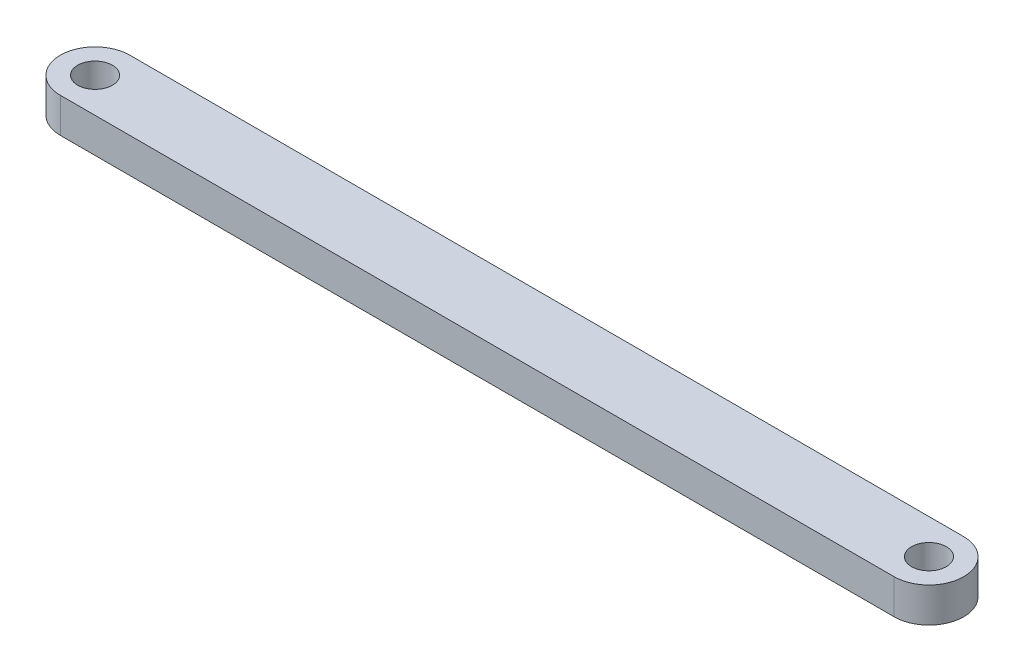
ISO-10303-21;
HEADER;
FILE_DESCRIPTION(('STEP AP214'),'2;1');
FILE_NAME('part.step','',(''),(''),'','','');
FILE_SCHEMA(('AUTOMOTIVE_DESIGN { 1 0 10303 214 1 1 1 1 }'));
ENDSEC;
DATA;
#1=APPLICATION_CONTEXT('core data for automotive mechanical design processes');
#2=APPLICATION_PROTOCOL_DEFINITION('international standard','automotive_design',2000,#1);
#3=PRODUCT_CONTEXT('',#1,'mechanical');
#4=PRODUCT('Part','Part','',(#3));
#5=PRODUCT_RELATED_PRODUCT_CATEGORY('part','',(#4));
#6=PRODUCT_DEFINITION_FORMATION('','',#4);
#7=PRODUCT_DEFINITION_CONTEXT('part definition',#1,'design');
#8=PRODUCT_DEFINITION('design','',#6,#7);
#9=PRODUCT_DEFINITION_SHAPE('','',#8);
#10=(LENGTH_UNIT() NAMED_UNIT(*) SI_UNIT(.MILLI.,.METRE.));
#11=(NAMED_UNIT(*) PLANE_ANGLE_UNIT() SI_UNIT($,.RADIAN.));
#12=(NAMED_UNIT(*) SI_UNIT($,.STERADIAN.) SOLID_ANGLE_UNIT());
#13=UNCERTAINTY_MEASURE_WITH_UNIT(LENGTH_MEASURE(1.E-05),#10,'distance_accuracy_value','');
#14=(GEOMETRIC_REPRESENTATION_CONTEXT(3) GLOBAL_UNCERTAINTY_ASSIGNED_CONTEXT((#13)) GLOBAL_UNIT_ASSIGNED_CONTEXT((#10,
#11,#12)) REPRESENTATION_CONTEXT('',''));
#15=CARTESIAN_POINT('',(0.,0.,0.));
#16=DIRECTION('',(0.,0.,1.));
#17=DIRECTION('',(1.,0.,0.));
#18=AXIS2_PLACEMENT_3D('',#15,#16,#17);
#19=CARTESIAN_POINT('',(0.,127.,0.));
#20=DIRECTION('',(0.,1.,0.));
#21=DIRECTION('',(0.,0.,1.));
#22=AXIS2_PLACEMENT_3D('',#19,#20,#21);
#23=PLANE('',#22);
#24=CARTESIAN_POINT('',(0.,127.,0.));
#25=DIRECTION('',(0.,1.,0.));
#26=DIRECTION('',(0.,0.,1.));
#27=AXIS2_PLACEMENT_3D('',#24,#25,#26);
#28=CIRCLE('',#27,63.5);
#29=CARTESIAN_POINT('',(0.,127.,63.5));
#30=VERTEX_POINT('',#29);
#31=EDGE_CURVE('E110',#30,#30,#28,.T.);
#32=ORIENTED_EDGE('',*,*,#31,.F.);
#33=EDGE_LOOP('',(#32));
#34=FACE_BOUND('',#33,.T.);
#35=CARTESIAN_POINT('',(0.,127.,0.));
#36=DIRECTION('',(0.,1.,0.));
#37=DIRECTION('',(0.,0.,1.));
#38=AXIS2_PLACEMENT_3D('',#35,#36,#37);
#39=CIRCLE('',#38,127.);
#40=CARTESIAN_POINT('',(0.,127.,-127.));
#41=VERTEX_POINT('',#40);
#42=CARTESIAN_POINT('',(0.,127.,127.));
#43=VERTEX_POINT('',#42);
#44=EDGE_CURVE('E94',#41,#43,#39,.T.);
#45=ORIENTED_EDGE('',*,*,#44,.T.);
#46=DIRECTION('',(1.,0.,0.));
#47=VECTOR('',#46,1.);
#48=CARTESIAN_POINT('',(0.,127.,127.));
#49=LINE('',#48,#47);
#50=CARTESIAN_POINT('',(3048.,127.,127.));
#51=VERTEX_POINT('',#50);
#52=EDGE_CURVE('E89',#43,#51,#49,.T.);
#53=ORIENTED_EDGE('',*,*,#52,.T.);
#54=CARTESIAN_POINT('',(3048.,127.,0.));
#55=DIRECTION('',(0.,1.,0.));
#56=DIRECTION('',(0.,0.,1.));
#57=AXIS2_PLACEMENT_3D('',#54,#55,#56);
#58=CIRCLE('',#57,127.);
#59=CARTESIAN_POINT('',(3048.,127.,-127.));
#60=VERTEX_POINT('',#59);
#61=EDGE_CURVE('E93',#51,#60,#58,.T.);
#62=ORIENTED_EDGE('',*,*,#61,.T.);
#63=DIRECTION('',(-1.,0.,0.));
#64=VECTOR('',#63,1.);
#65=CARTESIAN_POINT('',(0.,127.,-127.));
#66=LINE('',#65,#64);
#67=EDGE_CURVE('E58',#60,#41,#66,.T.);
#68=ORIENTED_EDGE('',*,*,#67,.T.);
#69=EDGE_LOOP('',(#45,#53,#62,#68));
#70=FACE_BOUND('',#69,.T.);
#71=CARTESIAN_POINT('',(3048.,127.,0.));
#72=DIRECTION('',(0.,1.,0.));
#73=DIRECTION('',(0.,0.,1.));
#74=AXIS2_PLACEMENT_3D('',#71,#72,#73);
#75=CIRCLE('',#74,63.4999999999999);
#76=CARTESIAN_POINT('',(3048.,127.,63.4999999999999));
#77=VERTEX_POINT('',#76);
#78=EDGE_CURVE('E124',#77,#77,#75,.T.);
#79=ORIENTED_EDGE('',*,*,#78,.F.);
#80=EDGE_LOOP('',(#79));
#81=FACE_BOUND('',#80,.T.);
#82=ADVANCED_FACE('F43',(#34,#70,#81),#23,.T.);
#83=CARTESIAN_POINT('',(0.,0.,0.));
#84=DIRECTION('',(0.,1.,0.));
#85=DIRECTION('',(0.,0.,1.));
#86=AXIS2_PLACEMENT_3D('',#83,#84,#85);
#87=PLANE('',#86);
#88=CARTESIAN_POINT('',(0.,0.,0.));
#89=DIRECTION('',(0.,1.,0.));
#90=DIRECTION('',(0.,0.,1.));
#91=AXIS2_PLACEMENT_3D('',#88,#89,#90);
#92=CIRCLE('',#91,127.);
#93=CARTESIAN_POINT('',(0.,0.,-127.));
#94=VERTEX_POINT('',#93);
#95=CARTESIAN_POINT('',(0.,0.,127.));
#96=VERTEX_POINT('',#95);
#97=EDGE_CURVE('E107',#94,#96,#92,.T.);
#98=ORIENTED_EDGE('',*,*,#97,.F.);
#99=DIRECTION('',(-1.,0.,0.));
#100=VECTOR('',#99,1.);
#101=CARTESIAN_POINT('',(0.,0.,-127.));
#102=LINE('',#101,#100);
#103=CARTESIAN_POINT('',(3048.,0.,-127.));
#104=VERTEX_POINT('',#103);
#105=EDGE_CURVE('E81',#104,#94,#102,.T.);
#106=ORIENTED_EDGE('',*,*,#105,.F.);
#107=CARTESIAN_POINT('',(3048.,0.,0.));
#108=DIRECTION('',(0.,1.,0.));
#109=DIRECTION('',(0.,0.,1.));
#110=AXIS2_PLACEMENT_3D('',#107,#108,#109);
#111=CIRCLE('',#110,127.);
#112=CARTESIAN_POINT('',(3048.,0.,127.));
#113=VERTEX_POINT('',#112);
#114=EDGE_CURVE('E77',#113,#104,#111,.T.);
#115=ORIENTED_EDGE('',*,*,#114,.F.);
#116=DIRECTION('',(1.,0.,0.));
#117=VECTOR('',#116,1.);
#118=CARTESIAN_POINT('',(0.,0.,127.));
#119=LINE('',#118,#117);
#120=EDGE_CURVE('E98',#96,#113,#119,.T.);
#121=ORIENTED_EDGE('',*,*,#120,.F.);
#122=EDGE_LOOP('',(#98,#106,#115,#121));
#123=FACE_BOUND('',#122,.T.);
#124=CARTESIAN_POINT('',(0.,0.,0.));
#125=DIRECTION('',(0.,1.,0.));
#126=DIRECTION('',(0.,0.,1.));
#127=AXIS2_PLACEMENT_3D('',#124,#125,#126);
#128=CIRCLE('',#127,63.5);
#129=CARTESIAN_POINT('',(0.,0.,63.5));
#130=VERTEX_POINT('',#129);
#131=EDGE_CURVE('E122',#130,#130,#128,.T.);
#132=ORIENTED_EDGE('',*,*,#131,.T.);
#133=EDGE_LOOP('',(#132));
#134=FACE_BOUND('',#133,.T.);
#135=CARTESIAN_POINT('',(3048.,0.,0.));
#136=DIRECTION('',(0.,1.,0.));
#137=DIRECTION('',(0.,0.,1.));
#138=AXIS2_PLACEMENT_3D('',#135,#136,#137);
#139=CIRCLE('',#138,63.4999999999999);
#140=CARTESIAN_POINT('',(3048.,0.,63.4999999999999));
#141=VERTEX_POINT('',#140);
#142=EDGE_CURVE('E126',#141,#141,#139,.T.);
#143=ORIENTED_EDGE('',*,*,#142,.T.);
#144=EDGE_LOOP('',(#143));
#145=FACE_BOUND('',#144,.T.);
#146=ADVANCED_FACE('F119',(#123,#134,#145),#87,.F.);
#147=CARTESIAN_POINT('',(0.,127.,0.));
#148=DIRECTION('',(0.,-1.,0.));
#149=DIRECTION('',(0.,0.,-1.));
#150=AXIS2_PLACEMENT_3D('',#147,#148,#149);
#151=CYLINDRICAL_SURFACE('',#150,127.);
#152=ORIENTED_EDGE('',*,*,#97,.T.);
#153=DIRECTION('',(0.,-1.,0.));
#154=VECTOR('',#153,1.);
#155=CARTESIAN_POINT('',(0.,127.,127.));
#156=LINE('',#155,#154);
#157=EDGE_CURVE('E11',#43,#96,#156,.T.);
#158=ORIENTED_EDGE('',*,*,#157,.F.);
#159=ORIENTED_EDGE('',*,*,#44,.F.);
#160=DIRECTION('',(0.,-1.,0.));
#161=VECTOR('',#160,1.);
#162=CARTESIAN_POINT('',(0.,127.,-127.));
#163=LINE('',#162,#161);
#164=EDGE_CURVE('E104',#41,#94,#163,.T.);
#165=ORIENTED_EDGE('',*,*,#164,.T.);
#166=EDGE_LOOP('',(#152,#158,#159,#165));
#167=FACE_BOUND('',#166,.T.);
#168=ADVANCED_FACE('F44',(#167),#151,.T.);
#169=CARTESIAN_POINT('',(0.,127.,127.));
#170=DIRECTION('',(0.,0.,-1.));
#171=DIRECTION('',(-1.,0.,0.));
#172=AXIS2_PLACEMENT_3D('',#169,#170,#171);
#173=PLANE('',#172);
#174=ORIENTED_EDGE('',*,*,#120,.T.);
#175=DIRECTION('',(0.,-1.,0.));
#176=VECTOR('',#175,1.);
#177=CARTESIAN_POINT('',(3048.,127.,127.));
#178=LINE('',#177,#176);
#179=EDGE_CURVE('E55',#51,#113,#178,.T.);
#180=ORIENTED_EDGE('',*,*,#179,.F.);
#181=ORIENTED_EDGE('',*,*,#52,.F.);
#182=ORIENTED_EDGE('',*,*,#157,.T.);
#183=EDGE_LOOP('',(#174,#180,#181,#182));
#184=FACE_BOUND('',#183,.T.);
#185=ADVANCED_FACE('F97',(#184),#173,.F.);
#186=CARTESIAN_POINT('',(3048.,127.,0.));
#187=DIRECTION('',(0.,-1.,0.));
#188=DIRECTION('',(0.,0.,-1.));
#189=AXIS2_PLACEMENT_3D('',#186,#187,#188);
#190=CYLINDRICAL_SURFACE('',#189,127.);
#191=ORIENTED_EDGE('',*,*,#114,.T.);
#192=DIRECTION('',(0.,-1.,0.));
#193=VECTOR('',#192,1.);
#194=CARTESIAN_POINT('',(3048.,127.,-127.));
#195=LINE('',#194,#193);
#196=EDGE_CURVE('E99',#60,#104,#195,.T.);
#197=ORIENTED_EDGE('',*,*,#196,.F.);
#198=ORIENTED_EDGE('',*,*,#61,.F.);
#199=ORIENTED_EDGE('',*,*,#179,.T.);
#200=EDGE_LOOP('',(#191,#197,#198,#199));
#201=FACE_BOUND('',#200,.T.);
#202=ADVANCED_FACE('F102',(#201),#190,.T.);
#203=CARTESIAN_POINT('',(0.,127.,-127.));
#204=DIRECTION('',(0.,0.,1.));
#205=DIRECTION('',(1.,0.,0.));
#206=AXIS2_PLACEMENT_3D('',#203,#204,#205);
#207=PLANE('',#206);
#208=ORIENTED_EDGE('',*,*,#105,.T.);
#209=ORIENTED_EDGE('',*,*,#164,.F.);
#210=ORIENTED_EDGE('',*,*,#67,.F.);
#211=ORIENTED_EDGE('',*,*,#196,.T.);
#212=EDGE_LOOP('',(#208,#209,#210,#211));
#213=FACE_BOUND('',#212,.T.);
#214=ADVANCED_FACE('F113',(#213),#207,.F.);
#215=CARTESIAN_POINT('',(0.,127.,0.));
#216=DIRECTION('',(0.,-1.,0.));
#217=DIRECTION('',(0.,0.,-1.));
#218=AXIS2_PLACEMENT_3D('',#215,#216,#217);
#219=CYLINDRICAL_SURFACE('',#218,63.5);
#220=ORIENTED_EDGE('',*,*,#31,.T.);
#221=EDGE_LOOP('',(#220));
#222=FACE_BOUND('',#221,.T.);
#223=ORIENTED_EDGE('',*,*,#131,.F.);
#224=EDGE_LOOP('',(#223));
#225=FACE_BOUND('',#224,.T.);
#226=ADVANCED_FACE('F144',(#222,#225),#219,.F.);
#227=CARTESIAN_POINT('',(3048.,127.,0.));
#228=DIRECTION('',(0.,-1.,0.));
#229=DIRECTION('',(0.,0.,-1.));
#230=AXIS2_PLACEMENT_3D('',#227,#228,#229);
#231=CYLINDRICAL_SURFACE('',#230,63.4999999999999);
#232=ORIENTED_EDGE('',*,*,#78,.T.);
#233=EDGE_LOOP('',(#232));
#234=FACE_BOUND('',#233,.T.);
#235=ORIENTED_EDGE('',*,*,#142,.F.);
#236=EDGE_LOOP('',(#235));
#237=FACE_BOUND('',#236,.T.);
#238=ADVANCED_FACE('F132',(#234,#237),#231,.F.);
#239=CLOSED_SHELL('',(#82,#146,#168,#185,#202,#214,#226,#238));
#240=MANIFOLD_SOLID_BREP('B2',#239);
#241=ADVANCED_BREP_SHAPE_REPRESENTATION('',(#18,#240),#14);
#242=SHAPE_DEFINITION_REPRESENTATION(#9,#241);
ENDSEC;
END-ISO-10303-21;
